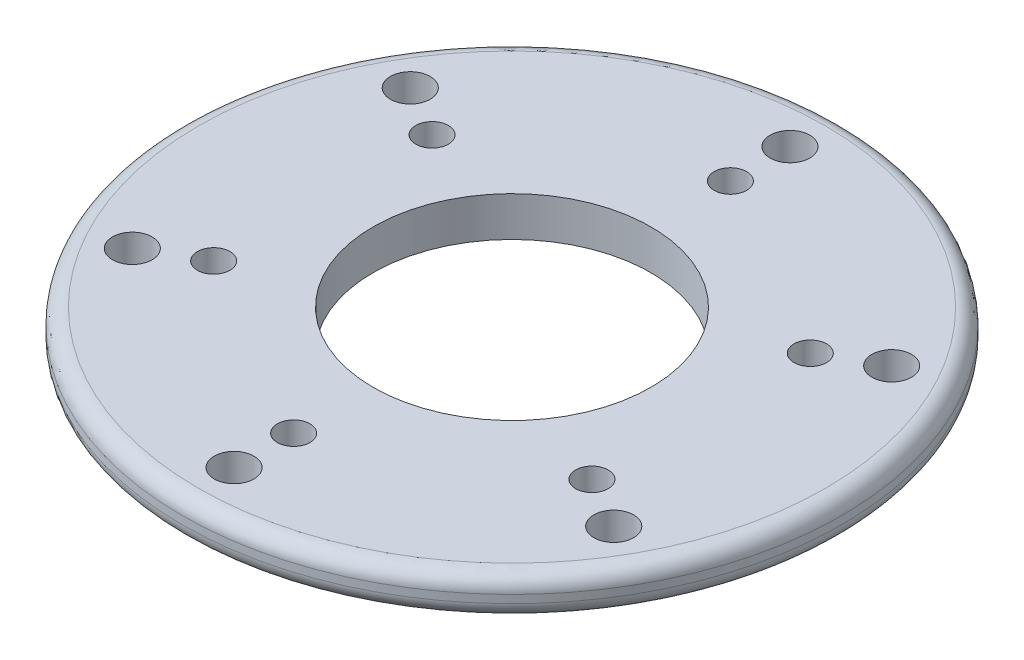
ISO-10303-21;
HEADER;
FILE_DESCRIPTION(('STEP AP214'),'2;1');
FILE_NAME('part.step','',(''),(''),'','','');
FILE_SCHEMA(('AUTOMOTIVE_DESIGN { 1 0 10303 214 1 1 1 1 }'));
ENDSEC;
DATA;
#1=APPLICATION_CONTEXT('core data for automotive mechanical design processes');
#2=APPLICATION_PROTOCOL_DEFINITION('international standard','automotive_design',2000,#1);
#3=PRODUCT_CONTEXT('',#1,'mechanical');
#4=PRODUCT('Part','Part','',(#3));
#5=PRODUCT_RELATED_PRODUCT_CATEGORY('part','',(#4));
#6=PRODUCT_DEFINITION_FORMATION('','',#4);
#7=PRODUCT_DEFINITION_CONTEXT('part definition',#1,'design');
#8=PRODUCT_DEFINITION('design','',#6,#7);
#9=PRODUCT_DEFINITION_SHAPE('','',#8);
#10=(LENGTH_UNIT() NAMED_UNIT(*) SI_UNIT(.MILLI.,.METRE.));
#11=(NAMED_UNIT(*) PLANE_ANGLE_UNIT() SI_UNIT($,.RADIAN.));
#12=(NAMED_UNIT(*) SI_UNIT($,.STERADIAN.) SOLID_ANGLE_UNIT());
#13=UNCERTAINTY_MEASURE_WITH_UNIT(LENGTH_MEASURE(1.E-05),#10,'distance_accuracy_value','');
#14=(GEOMETRIC_REPRESENTATION_CONTEXT(3) GLOBAL_UNCERTAINTY_ASSIGNED_CONTEXT((#13)) GLOBAL_UNIT_ASSIGNED_CONTEXT((#10,
#11,#12)) REPRESENTATION_CONTEXT('',''));
#15=CARTESIAN_POINT('',(0.,0.,0.));
#16=DIRECTION('',(0.,0.,1.));
#17=DIRECTION('',(1.,0.,0.));
#18=AXIS2_PLACEMENT_3D('',#15,#16,#17);
#19=CARTESIAN_POINT('',(0.,2.,0.));
#20=DIRECTION('',(0.,1.,0.));
#21=DIRECTION('',(0.,0.,1.));
#22=AXIS2_PLACEMENT_3D('',#19,#20,#21);
#23=TOROIDAL_SURFACE('',#22,39.5,2.);
#24=CARTESIAN_POINT('',(0.,0.,0.));
#25=DIRECTION('',(0.,1.,0.));
#26=DIRECTION('',(0.,0.,1.));
#27=AXIS2_PLACEMENT_3D('',#24,#25,#26);
#28=CIRCLE('',#27,39.5);
#29=CARTESIAN_POINT('',(0.,0.,39.5));
#30=VERTEX_POINT('',#29);
#31=EDGE_CURVE('E37',#30,#30,#28,.F.);
#32=ORIENTED_EDGE('',*,*,#31,.F.);
#33=EDGE_LOOP('',(#32));
#34=FACE_BOUND('',#33,.T.);
#35=CARTESIAN_POINT('',(0.,2.,0.));
#36=DIRECTION('',(0.,1.,0.));
#37=DIRECTION('',(0.,0.,1.));
#38=AXIS2_PLACEMENT_3D('',#35,#36,#37);
#39=CIRCLE('',#38,41.5);
#40=CARTESIAN_POINT('',(0.,2.,41.5));
#41=VERTEX_POINT('',#40);
#42=EDGE_CURVE('E10',#41,#41,#39,.T.);
#43=ORIENTED_EDGE('',*,*,#42,.F.);
#44=EDGE_LOOP('',(#43));
#45=FACE_BOUND('',#44,.T.);
#46=ADVANCED_FACE('F31',(#34,#45),#23,.T.);
#47=CARTESIAN_POINT('',(0.,3.,0.));
#48=DIRECTION('',(0.,1.,0.));
#49=DIRECTION('',(0.,0.,1.));
#50=AXIS2_PLACEMENT_3D('',#47,#48,#49);
#51=TOROIDAL_SURFACE('',#50,39.5,2.);
#52=CARTESIAN_POINT('',(0.,3.,0.));
#53=DIRECTION('',(0.,1.,0.));
#54=DIRECTION('',(0.,0.,1.));
#55=AXIS2_PLACEMENT_3D('',#52,#53,#54);
#56=CIRCLE('',#55,41.5);
#57=CARTESIAN_POINT('',(0.,3.,41.5));
#58=VERTEX_POINT('',#57);
#59=EDGE_CURVE('E45',#58,#58,#56,.F.);
#60=ORIENTED_EDGE('',*,*,#59,.F.);
#61=EDGE_LOOP('',(#60));
#62=FACE_BOUND('',#61,.T.);
#63=CARTESIAN_POINT('',(0.,5.,0.));
#64=DIRECTION('',(0.,1.,0.));
#65=DIRECTION('',(0.,0.,1.));
#66=AXIS2_PLACEMENT_3D('',#63,#64,#65);
#67=CIRCLE('',#66,39.5);
#68=CARTESIAN_POINT('',(0.,5.,39.5));
#69=VERTEX_POINT('',#68);
#70=EDGE_CURVE('E41',#69,#69,#67,.T.);
#71=ORIENTED_EDGE('',*,*,#70,.F.);
#72=EDGE_LOOP('',(#71));
#73=FACE_BOUND('',#72,.T.);
#74=ADVANCED_FACE('F184',(#62,#73),#51,.T.);
#75=CARTESIAN_POINT('',(0.,5.,0.));
#76=DIRECTION('',(0.,-1.,0.));
#77=DIRECTION('',(0.,0.,-1.));
#78=AXIS2_PLACEMENT_3D('',#75,#76,#77);
#79=CYLINDRICAL_SURFACE('',#78,41.5);
#80=ORIENTED_EDGE('',*,*,#42,.T.);
#81=EDGE_LOOP('',(#80));
#82=FACE_BOUND('',#81,.T.);
#83=ORIENTED_EDGE('',*,*,#59,.T.);
#84=EDGE_LOOP('',(#83));
#85=FACE_BOUND('',#84,.T.);
#86=ADVANCED_FACE('F142',(#82,#85),#79,.T.);
#87=CARTESIAN_POINT('',(0.,5.,0.));
#88=DIRECTION('',(0.,1.,0.));
#89=DIRECTION('',(0.,0.,1.));
#90=AXIS2_PLACEMENT_3D('',#87,#88,#89);
#91=PLANE('',#90);
#92=ORIENTED_EDGE('',*,*,#70,.T.);
#93=EDGE_LOOP('',(#92));
#94=FACE_BOUND('',#93,.T.);
#95=CARTESIAN_POINT('',(0.,5.,0.));
#96=DIRECTION('',(0.,1.,0.));
#97=DIRECTION('',(0.,0.,1.));
#98=AXIS2_PLACEMENT_3D('',#95,#96,#97);
#99=CIRCLE('',#98,17.5);
#100=CARTESIAN_POINT('',(0.,5.,17.5));
#101=VERTEX_POINT('',#100);
#102=EDGE_CURVE('E123',#101,#101,#99,.T.);
#103=ORIENTED_EDGE('',*,*,#102,.F.);
#104=EDGE_LOOP('',(#103));
#105=FACE_BOUND('',#104,.T.);
#106=CARTESIAN_POINT('',(-30.3108891324546,5.,-17.4999999999987));
#107=DIRECTION('',(0.,1.,0.));
#108=DIRECTION('',(0.,0.,1.));
#109=AXIS2_PLACEMENT_3D('',#106,#107,#108);
#110=CIRCLE('',#109,2.5);
#111=CARTESIAN_POINT('',(-30.3108891324546,5.,-14.9999999999987));
#112=VERTEX_POINT('',#111);
#113=EDGE_CURVE('E117',#112,#112,#110,.T.);
#114=ORIENTED_EDGE('',*,*,#113,.F.);
#115=EDGE_LOOP('',(#114));
#116=FACE_BOUND('',#115,.T.);
#117=CARTESIAN_POINT('',(-30.3108891324531,5.,17.5000000000013));
#118=DIRECTION('',(0.,1.,0.));
#119=DIRECTION('',(0.,0.,1.));
#120=AXIS2_PLACEMENT_3D('',#117,#118,#119);
#121=CIRCLE('',#120,2.5);
#122=CARTESIAN_POINT('',(-30.3108891324531,5.,20.0000000000013));
#123=VERTEX_POINT('',#122);
#124=EDGE_CURVE('E111',#123,#123,#121,.T.);
#125=ORIENTED_EDGE('',*,*,#124,.F.);
#126=EDGE_LOOP('',(#125));
#127=FACE_BOUND('',#126,.T.);
#128=CARTESIAN_POINT('',(2.97570696259839E-12,5.,35.));
#129=DIRECTION('',(0.,1.,0.));
#130=DIRECTION('',(0.,0.,1.));
#131=AXIS2_PLACEMENT_3D('',#128,#129,#130);
#132=CIRCLE('',#131,2.5);
#133=CARTESIAN_POINT('',(2.97570696259839E-12,5.,37.5));
#134=VERTEX_POINT('',#133);
#135=EDGE_CURVE('E105',#134,#134,#132,.T.);
#136=ORIENTED_EDGE('',*,*,#135,.F.);
#137=EDGE_LOOP('',(#136));
#138=FACE_BOUND('',#137,.T.);
#139=CARTESIAN_POINT('',(30.3108891324576,5.,17.4999999999987));
#140=DIRECTION('',(0.,1.,0.));
#141=DIRECTION('',(0.,0.,1.));
#142=AXIS2_PLACEMENT_3D('',#139,#140,#141);
#143=CIRCLE('',#142,2.5);
#144=CARTESIAN_POINT('',(30.3108891324576,5.,19.9999999999987));
#145=VERTEX_POINT('',#144);
#146=EDGE_CURVE('E99',#145,#145,#143,.T.);
#147=ORIENTED_EDGE('',*,*,#146,.F.);
#148=EDGE_LOOP('',(#147));
#149=FACE_BOUND('',#148,.T.);
#150=CARTESIAN_POINT('',(30.3108891324561,5.,-17.5000000000013));
#151=DIRECTION('',(0.,1.,0.));
#152=DIRECTION('',(0.,0.,1.));
#153=AXIS2_PLACEMENT_3D('',#150,#151,#152);
#154=CIRCLE('',#153,2.5);
#155=CARTESIAN_POINT('',(30.3108891324561,5.,-15.0000000000013));
#156=VERTEX_POINT('',#155);
#157=EDGE_CURVE('E93',#156,#156,#154,.T.);
#158=ORIENTED_EDGE('',*,*,#157,.F.);
#159=EDGE_LOOP('',(#158));
#160=FACE_BOUND('',#159,.T.);
#161=CARTESIAN_POINT('',(0.,5.,-35.));
#162=DIRECTION('',(0.,1.,0.));
#163=DIRECTION('',(0.,0.,1.));
#164=AXIS2_PLACEMENT_3D('',#161,#162,#163);
#165=CIRCLE('',#164,2.5);
#166=CARTESIAN_POINT('',(0.,5.,-32.5));
#167=VERTEX_POINT('',#166);
#168=EDGE_CURVE('E87',#167,#167,#165,.T.);
#169=ORIENTED_EDGE('',*,*,#168,.F.);
#170=EDGE_LOOP('',(#169));
#171=FACE_BOUND('',#170,.T.);
#172=CARTESIAN_POINT('',(-23.8156986040709,5.,-13.749999999998));
#173=DIRECTION('',(0.,1.,0.));
#174=DIRECTION('',(0.,0.,1.));
#175=AXIS2_PLACEMENT_3D('',#172,#173,#174);
#176=CIRCLE('',#175,2.05);
#177=CARTESIAN_POINT('',(-23.8156986040709,5.,-11.699999999998));
#178=VERTEX_POINT('',#177);
#179=EDGE_CURVE('E81',#178,#178,#176,.T.);
#180=ORIENTED_EDGE('',*,*,#179,.F.);
#181=EDGE_LOOP('',(#180));
#182=FACE_BOUND('',#181,.T.);
#183=CARTESIAN_POINT('',(-23.8156986040685,5.,13.750000000002));
#184=DIRECTION('',(0.,1.,0.));
#185=DIRECTION('',(0.,0.,1.));
#186=AXIS2_PLACEMENT_3D('',#183,#184,#185);
#187=CIRCLE('',#186,2.05);
#188=CARTESIAN_POINT('',(-23.8156986040685,5.,15.800000000002));
#189=VERTEX_POINT('',#188);
#190=EDGE_CURVE('E75',#189,#189,#187,.T.);
#191=ORIENTED_EDGE('',*,*,#190,.F.);
#192=EDGE_LOOP('',(#191));
#193=FACE_BOUND('',#192,.T.);
#194=CARTESIAN_POINT('',(4.68284649862135E-12,5.,27.5));
#195=DIRECTION('',(0.,1.,0.));
#196=DIRECTION('',(0.,0.,1.));
#197=AXIS2_PLACEMENT_3D('',#194,#195,#196);
#198=CIRCLE('',#197,2.05);
#199=CARTESIAN_POINT('',(4.68284649862135E-12,5.,29.55));
#200=VERTEX_POINT('',#199);
#201=EDGE_CURVE('E69',#200,#200,#198,.T.);
#202=ORIENTED_EDGE('',*,*,#201,.F.);
#203=EDGE_LOOP('',(#202));
#204=FACE_BOUND('',#203,.T.);
#205=CARTESIAN_POINT('',(23.8156986040756,5.,13.749999999998));
#206=DIRECTION('',(0.,1.,0.));
#207=DIRECTION('',(0.,0.,1.));
#208=AXIS2_PLACEMENT_3D('',#205,#206,#207);
#209=CIRCLE('',#208,2.05);
#210=CARTESIAN_POINT('',(23.8156986040756,5.,15.799999999998));
#211=VERTEX_POINT('',#210);
#212=EDGE_CURVE('E63',#211,#211,#209,.T.);
#213=ORIENTED_EDGE('',*,*,#212,.F.);
#214=EDGE_LOOP('',(#213));
#215=FACE_BOUND('',#214,.T.);
#216=CARTESIAN_POINT('',(23.8156986040732,5.,-13.750000000002));
#217=DIRECTION('',(0.,1.,0.));
#218=DIRECTION('',(0.,0.,1.));
#219=AXIS2_PLACEMENT_3D('',#216,#217,#218);
#220=CIRCLE('',#219,2.05);
#221=CARTESIAN_POINT('',(23.8156986040732,5.,-11.700000000002));
#222=VERTEX_POINT('',#221);
#223=EDGE_CURVE('E57',#222,#222,#220,.T.);
#224=ORIENTED_EDGE('',*,*,#223,.F.);
#225=EDGE_LOOP('',(#224));
#226=FACE_BOUND('',#225,.T.);
#227=CARTESIAN_POINT('',(0.,5.,-27.5));
#228=DIRECTION('',(0.,1.,0.));
#229=DIRECTION('',(0.,0.,1.));
#230=AXIS2_PLACEMENT_3D('',#227,#228,#229);
#231=CIRCLE('',#230,2.05);
#232=CARTESIAN_POINT('',(0.,5.,-25.45));
#233=VERTEX_POINT('',#232);
#234=EDGE_CURVE('E51',#233,#233,#231,.T.);
#235=ORIENTED_EDGE('',*,*,#234,.F.);
#236=EDGE_LOOP('',(#235));
#237=FACE_BOUND('',#236,.T.);
#238=ADVANCED_FACE('F139',(#94,#105,#116,#127,#138,#149,#160,#171,#182,#193,#204,#215,#226,
#237),#91,.T.);
#239=CARTESIAN_POINT('',(0.,0.,0.));
#240=DIRECTION('',(0.,1.,0.));
#241=DIRECTION('',(0.,0.,1.));
#242=AXIS2_PLACEMENT_3D('',#239,#240,#241);
#243=PLANE('',#242);
#244=ORIENTED_EDGE('',*,*,#31,.T.);
#245=EDGE_LOOP('',(#244));
#246=FACE_BOUND('',#245,.T.);
#247=CARTESIAN_POINT('',(0.,0.,0.));
#248=DIRECTION('',(0.,1.,0.));
#249=DIRECTION('',(0.,0.,1.));
#250=AXIS2_PLACEMENT_3D('',#247,#248,#249);
#251=CIRCLE('',#250,17.5);
#252=CARTESIAN_POINT('',(0.,0.,17.5));
#253=VERTEX_POINT('',#252);
#254=EDGE_CURVE('E120',#253,#253,#251,.T.);
#255=ORIENTED_EDGE('',*,*,#254,.T.);
#256=EDGE_LOOP('',(#255));
#257=FACE_BOUND('',#256,.T.);
#258=CARTESIAN_POINT('',(-30.3108891324546,0.,-17.4999999999987));
#259=DIRECTION('',(0.,1.,0.));
#260=DIRECTION('',(0.,0.,1.));
#261=AXIS2_PLACEMENT_3D('',#258,#259,#260);
#262=CIRCLE('',#261,2.5);
#263=CARTESIAN_POINT('',(-30.3108891324546,0.,-14.9999999999987));
#264=VERTEX_POINT('',#263);
#265=EDGE_CURVE('E114',#264,#264,#262,.T.);
#266=ORIENTED_EDGE('',*,*,#265,.T.);
#267=EDGE_LOOP('',(#266));
#268=FACE_BOUND('',#267,.T.);
#269=CARTESIAN_POINT('',(-30.3108891324531,0.,17.5000000000013));
#270=DIRECTION('',(0.,1.,0.));
#271=DIRECTION('',(0.,0.,1.));
#272=AXIS2_PLACEMENT_3D('',#269,#270,#271);
#273=CIRCLE('',#272,2.5);
#274=CARTESIAN_POINT('',(-30.3108891324531,0.,20.0000000000013));
#275=VERTEX_POINT('',#274);
#276=EDGE_CURVE('E108',#275,#275,#273,.T.);
#277=ORIENTED_EDGE('',*,*,#276,.T.);
#278=EDGE_LOOP('',(#277));
#279=FACE_BOUND('',#278,.T.);
#280=CARTESIAN_POINT('',(2.97570696259839E-12,0.,35.));
#281=DIRECTION('',(0.,1.,0.));
#282=DIRECTION('',(0.,0.,1.));
#283=AXIS2_PLACEMENT_3D('',#280,#281,#282);
#284=CIRCLE('',#283,2.5);
#285=CARTESIAN_POINT('',(2.97570696259839E-12,0.,37.5));
#286=VERTEX_POINT('',#285);
#287=EDGE_CURVE('E102',#286,#286,#284,.T.);
#288=ORIENTED_EDGE('',*,*,#287,.T.);
#289=EDGE_LOOP('',(#288));
#290=FACE_BOUND('',#289,.T.);
#291=CARTESIAN_POINT('',(30.3108891324576,0.,17.4999999999987));
#292=DIRECTION('',(0.,1.,0.));
#293=DIRECTION('',(0.,0.,1.));
#294=AXIS2_PLACEMENT_3D('',#291,#292,#293);
#295=CIRCLE('',#294,2.5);
#296=CARTESIAN_POINT('',(30.3108891324576,0.,19.9999999999987));
#297=VERTEX_POINT('',#296);
#298=EDGE_CURVE('E96',#297,#297,#295,.T.);
#299=ORIENTED_EDGE('',*,*,#298,.T.);
#300=EDGE_LOOP('',(#299));
#301=FACE_BOUND('',#300,.T.);
#302=CARTESIAN_POINT('',(30.3108891324561,0.,-17.5000000000013));
#303=DIRECTION('',(0.,1.,0.));
#304=DIRECTION('',(0.,0.,1.));
#305=AXIS2_PLACEMENT_3D('',#302,#303,#304);
#306=CIRCLE('',#305,2.5);
#307=CARTESIAN_POINT('',(30.3108891324561,0.,-15.0000000000013));
#308=VERTEX_POINT('',#307);
#309=EDGE_CURVE('E90',#308,#308,#306,.T.);
#310=ORIENTED_EDGE('',*,*,#309,.T.);
#311=EDGE_LOOP('',(#310));
#312=FACE_BOUND('',#311,.T.);
#313=CARTESIAN_POINT('',(0.,0.,-35.));
#314=DIRECTION('',(0.,1.,0.));
#315=DIRECTION('',(0.,0.,1.));
#316=AXIS2_PLACEMENT_3D('',#313,#314,#315);
#317=CIRCLE('',#316,2.5);
#318=CARTESIAN_POINT('',(0.,0.,-32.5));
#319=VERTEX_POINT('',#318);
#320=EDGE_CURVE('E84',#319,#319,#317,.T.);
#321=ORIENTED_EDGE('',*,*,#320,.T.);
#322=EDGE_LOOP('',(#321));
#323=FACE_BOUND('',#322,.T.);
#324=CARTESIAN_POINT('',(-23.8156986040709,0.,-13.749999999998));
#325=DIRECTION('',(0.,1.,0.));
#326=DIRECTION('',(0.,0.,1.));
#327=AXIS2_PLACEMENT_3D('',#324,#325,#326);
#328=CIRCLE('',#327,2.05);
#329=CARTESIAN_POINT('',(-23.8156986040709,0.,-11.699999999998));
#330=VERTEX_POINT('',#329);
#331=EDGE_CURVE('E78',#330,#330,#328,.T.);
#332=ORIENTED_EDGE('',*,*,#331,.T.);
#333=EDGE_LOOP('',(#332));
#334=FACE_BOUND('',#333,.T.);
#335=CARTESIAN_POINT('',(-23.8156986040685,0.,13.750000000002));
#336=DIRECTION('',(0.,1.,0.));
#337=DIRECTION('',(0.,0.,1.));
#338=AXIS2_PLACEMENT_3D('',#335,#336,#337);
#339=CIRCLE('',#338,2.05);
#340=CARTESIAN_POINT('',(-23.8156986040685,0.,15.800000000002));
#341=VERTEX_POINT('',#340);
#342=EDGE_CURVE('E72',#341,#341,#339,.T.);
#343=ORIENTED_EDGE('',*,*,#342,.T.);
#344=EDGE_LOOP('',(#343));
#345=FACE_BOUND('',#344,.T.);
#346=CARTESIAN_POINT('',(4.68284649862135E-12,0.,27.5));
#347=DIRECTION('',(0.,1.,0.));
#348=DIRECTION('',(0.,0.,1.));
#349=AXIS2_PLACEMENT_3D('',#346,#347,#348);
#350=CIRCLE('',#349,2.05);
#351=CARTESIAN_POINT('',(4.68284649862135E-12,0.,29.55));
#352=VERTEX_POINT('',#351);
#353=EDGE_CURVE('E66',#352,#352,#350,.T.);
#354=ORIENTED_EDGE('',*,*,#353,.T.);
#355=EDGE_LOOP('',(#354));
#356=FACE_BOUND('',#355,.T.);
#357=CARTESIAN_POINT('',(23.8156986040756,0.,13.749999999998));
#358=DIRECTION('',(0.,1.,0.));
#359=DIRECTION('',(0.,0.,1.));
#360=AXIS2_PLACEMENT_3D('',#357,#358,#359);
#361=CIRCLE('',#360,2.05);
#362=CARTESIAN_POINT('',(23.8156986040756,0.,15.799999999998));
#363=VERTEX_POINT('',#362);
#364=EDGE_CURVE('E60',#363,#363,#361,.T.);
#365=ORIENTED_EDGE('',*,*,#364,.T.);
#366=EDGE_LOOP('',(#365));
#367=FACE_BOUND('',#366,.T.);
#368=CARTESIAN_POINT('',(23.8156986040732,0.,-13.750000000002));
#369=DIRECTION('',(0.,1.,0.));
#370=DIRECTION('',(0.,0.,1.));
#371=AXIS2_PLACEMENT_3D('',#368,#369,#370);
#372=CIRCLE('',#371,2.05);
#373=CARTESIAN_POINT('',(23.8156986040732,0.,-11.700000000002));
#374=VERTEX_POINT('',#373);
#375=EDGE_CURVE('E54',#374,#374,#372,.T.);
#376=ORIENTED_EDGE('',*,*,#375,.T.);
#377=EDGE_LOOP('',(#376));
#378=FACE_BOUND('',#377,.T.);
#379=CARTESIAN_POINT('',(0.,0.,-27.5));
#380=DIRECTION('',(0.,1.,0.));
#381=DIRECTION('',(0.,0.,1.));
#382=AXIS2_PLACEMENT_3D('',#379,#380,#381);
#383=CIRCLE('',#382,2.05);
#384=CARTESIAN_POINT('',(0.,0.,-25.45));
#385=VERTEX_POINT('',#384);
#386=EDGE_CURVE('E50',#385,#385,#383,.T.);
#387=ORIENTED_EDGE('',*,*,#386,.T.);
#388=EDGE_LOOP('',(#387));
#389=FACE_BOUND('',#388,.T.);
#390=ADVANCED_FACE('F129',(#246,#257,#268,#279,#290,#301,#312,#323,#334,#345,#356,#367,#378,
#389),#243,.F.);
#391=CARTESIAN_POINT('',(0.,0.,-27.5));
#392=DIRECTION('',(0.,1.,0.));
#393=DIRECTION('',(0.,0.,1.));
#394=AXIS2_PLACEMENT_3D('',#391,#392,#393);
#395=CYLINDRICAL_SURFACE('',#394,2.05);
#396=ORIENTED_EDGE('',*,*,#386,.F.);
#397=EDGE_LOOP('',(#396));
#398=FACE_BOUND('',#397,.T.);
#399=ORIENTED_EDGE('',*,*,#234,.T.);
#400=EDGE_LOOP('',(#399));
#401=FACE_BOUND('',#400,.T.);
#402=ADVANCED_FACE('F169',(#398,#401),#395,.F.);
#403=CARTESIAN_POINT('',(23.8156986040732,0.,-13.750000000002));
#404=DIRECTION('',(0.,1.,0.));
#405=DIRECTION('',(0.,0.,1.));
#406=AXIS2_PLACEMENT_3D('',#403,#404,#405);
#407=CYLINDRICAL_SURFACE('',#406,2.05);
#408=ORIENTED_EDGE('',*,*,#375,.F.);
#409=EDGE_LOOP('',(#408));
#410=FACE_BOUND('',#409,.T.);
#411=ORIENTED_EDGE('',*,*,#223,.T.);
#412=EDGE_LOOP('',(#411));
#413=FACE_BOUND('',#412,.T.);
#414=ADVANCED_FACE('F171',(#410,#413),#407,.F.);
#415=CARTESIAN_POINT('',(23.8156986040756,0.,13.749999999998));
#416=DIRECTION('',(0.,1.,0.));
#417=DIRECTION('',(0.,0.,1.));
#418=AXIS2_PLACEMENT_3D('',#415,#416,#417);
#419=CYLINDRICAL_SURFACE('',#418,2.05);
#420=ORIENTED_EDGE('',*,*,#364,.F.);
#421=EDGE_LOOP('',(#420));
#422=FACE_BOUND('',#421,.T.);
#423=ORIENTED_EDGE('',*,*,#212,.T.);
#424=EDGE_LOOP('',(#423));
#425=FACE_BOUND('',#424,.T.);
#426=ADVANCED_FACE('F178',(#422,#425),#419,.F.);
#427=CARTESIAN_POINT('',(4.68284649862135E-12,0.,27.5));
#428=DIRECTION('',(0.,1.,0.));
#429=DIRECTION('',(0.,0.,1.));
#430=AXIS2_PLACEMENT_3D('',#427,#428,#429);
#431=CYLINDRICAL_SURFACE('',#430,2.05);
#432=ORIENTED_EDGE('',*,*,#353,.F.);
#433=EDGE_LOOP('',(#432));
#434=FACE_BOUND('',#433,.T.);
#435=ORIENTED_EDGE('',*,*,#201,.T.);
#436=EDGE_LOOP('',(#435));
#437=FACE_BOUND('',#436,.T.);
#438=ADVANCED_FACE('F230',(#434,#437),#431,.F.);
#439=CARTESIAN_POINT('',(-23.8156986040685,0.,13.750000000002));
#440=DIRECTION('',(0.,1.,0.));
#441=DIRECTION('',(0.,0.,1.));
#442=AXIS2_PLACEMENT_3D('',#439,#440,#441);
#443=CYLINDRICAL_SURFACE('',#442,2.05);
#444=ORIENTED_EDGE('',*,*,#342,.F.);
#445=EDGE_LOOP('',(#444));
#446=FACE_BOUND('',#445,.T.);
#447=ORIENTED_EDGE('',*,*,#190,.T.);
#448=EDGE_LOOP('',(#447));
#449=FACE_BOUND('',#448,.T.);
#450=ADVANCED_FACE('F239',(#446,#449),#443,.F.);
#451=CARTESIAN_POINT('',(-23.8156986040709,0.,-13.749999999998));
#452=DIRECTION('',(0.,1.,0.));
#453=DIRECTION('',(0.,0.,1.));
#454=AXIS2_PLACEMENT_3D('',#451,#452,#453);
#455=CYLINDRICAL_SURFACE('',#454,2.05);
#456=ORIENTED_EDGE('',*,*,#331,.F.);
#457=EDGE_LOOP('',(#456));
#458=FACE_BOUND('',#457,.T.);
#459=ORIENTED_EDGE('',*,*,#179,.T.);
#460=EDGE_LOOP('',(#459));
#461=FACE_BOUND('',#460,.T.);
#462=ADVANCED_FACE('F248',(#458,#461),#455,.F.);
#463=CARTESIAN_POINT('',(0.,0.,-35.));
#464=DIRECTION('',(0.,1.,0.));
#465=DIRECTION('',(0.,0.,1.));
#466=AXIS2_PLACEMENT_3D('',#463,#464,#465);
#467=CYLINDRICAL_SURFACE('',#466,2.5);
#468=ORIENTED_EDGE('',*,*,#320,.F.);
#469=EDGE_LOOP('',(#468));
#470=FACE_BOUND('',#469,.T.);
#471=ORIENTED_EDGE('',*,*,#168,.T.);
#472=EDGE_LOOP('',(#471));
#473=FACE_BOUND('',#472,.T.);
#474=ADVANCED_FACE('F257',(#470,#473),#467,.F.);
#475=CARTESIAN_POINT('',(30.3108891324561,0.,-17.5000000000013));
#476=DIRECTION('',(0.,1.,0.));
#477=DIRECTION('',(0.,0.,1.));
#478=AXIS2_PLACEMENT_3D('',#475,#476,#477);
#479=CYLINDRICAL_SURFACE('',#478,2.5);
#480=ORIENTED_EDGE('',*,*,#309,.F.);
#481=EDGE_LOOP('',(#480));
#482=FACE_BOUND('',#481,.T.);
#483=ORIENTED_EDGE('',*,*,#157,.T.);
#484=EDGE_LOOP('',(#483));
#485=FACE_BOUND('',#484,.T.);
#486=ADVANCED_FACE('F266',(#482,#485),#479,.F.);
#487=CARTESIAN_POINT('',(30.3108891324576,0.,17.4999999999987));
#488=DIRECTION('',(0.,1.,0.));
#489=DIRECTION('',(0.,0.,1.));
#490=AXIS2_PLACEMENT_3D('',#487,#488,#489);
#491=CYLINDRICAL_SURFACE('',#490,2.5);
#492=ORIENTED_EDGE('',*,*,#298,.F.);
#493=EDGE_LOOP('',(#492));
#494=FACE_BOUND('',#493,.T.);
#495=ORIENTED_EDGE('',*,*,#146,.T.);
#496=EDGE_LOOP('',(#495));
#497=FACE_BOUND('',#496,.T.);
#498=ADVANCED_FACE('F275',(#494,#497),#491,.F.);
#499=CARTESIAN_POINT('',(2.97570696259839E-12,0.,35.));
#500=DIRECTION('',(0.,1.,0.));
#501=DIRECTION('',(0.,0.,1.));
#502=AXIS2_PLACEMENT_3D('',#499,#500,#501);
#503=CYLINDRICAL_SURFACE('',#502,2.5);
#504=ORIENTED_EDGE('',*,*,#287,.F.);
#505=EDGE_LOOP('',(#504));
#506=FACE_BOUND('',#505,.T.);
#507=ORIENTED_EDGE('',*,*,#135,.T.);
#508=EDGE_LOOP('',(#507));
#509=FACE_BOUND('',#508,.T.);
#510=ADVANCED_FACE('F284',(#506,#509),#503,.F.);
#511=CARTESIAN_POINT('',(-30.3108891324531,0.,17.5000000000013));
#512=DIRECTION('',(0.,1.,0.));
#513=DIRECTION('',(0.,0.,1.));
#514=AXIS2_PLACEMENT_3D('',#511,#512,#513);
#515=CYLINDRICAL_SURFACE('',#514,2.5);
#516=ORIENTED_EDGE('',*,*,#276,.F.);
#517=EDGE_LOOP('',(#516));
#518=FACE_BOUND('',#517,.T.);
#519=ORIENTED_EDGE('',*,*,#124,.T.);
#520=EDGE_LOOP('',(#519));
#521=FACE_BOUND('',#520,.T.);
#522=ADVANCED_FACE('F293',(#518,#521),#515,.F.);
#523=CARTESIAN_POINT('',(-30.3108891324546,0.,-17.4999999999987));
#524=DIRECTION('',(0.,1.,0.));
#525=DIRECTION('',(0.,0.,1.));
#526=AXIS2_PLACEMENT_3D('',#523,#524,#525);
#527=CYLINDRICAL_SURFACE('',#526,2.5);
#528=ORIENTED_EDGE('',*,*,#265,.F.);
#529=EDGE_LOOP('',(#528));
#530=FACE_BOUND('',#529,.T.);
#531=ORIENTED_EDGE('',*,*,#113,.T.);
#532=EDGE_LOOP('',(#531));
#533=FACE_BOUND('',#532,.T.);
#534=ADVANCED_FACE('F135',(#530,#533),#527,.F.);
#535=CARTESIAN_POINT('',(0.,0.,0.));
#536=DIRECTION('',(0.,1.,0.));
#537=DIRECTION('',(0.,0.,1.));
#538=AXIS2_PLACEMENT_3D('',#535,#536,#537);
#539=CYLINDRICAL_SURFACE('',#538,17.5);
#540=ORIENTED_EDGE('',*,*,#254,.F.);
#541=EDGE_LOOP('',(#540));
#542=FACE_BOUND('',#541,.T.);
#543=ORIENTED_EDGE('',*,*,#102,.T.);
#544=EDGE_LOOP('',(#543));
#545=FACE_BOUND('',#544,.T.);
#546=ADVANCED_FACE('F132',(#542,#545),#539,.F.);
#547=CLOSED_SHELL('',(#46,#74,#86,#238,#390,#402,#414,#426,#438,#450,#462,#474,#486,#498,#510,
#522,#534,#546));
#548=MANIFOLD_SOLID_BREP('B2',#547);
#549=ADVANCED_BREP_SHAPE_REPRESENTATION('',(#18,#548),#14);
#550=SHAPE_DEFINITION_REPRESENTATION(#9,#549);
ENDSEC;
END-ISO-10303-21;
